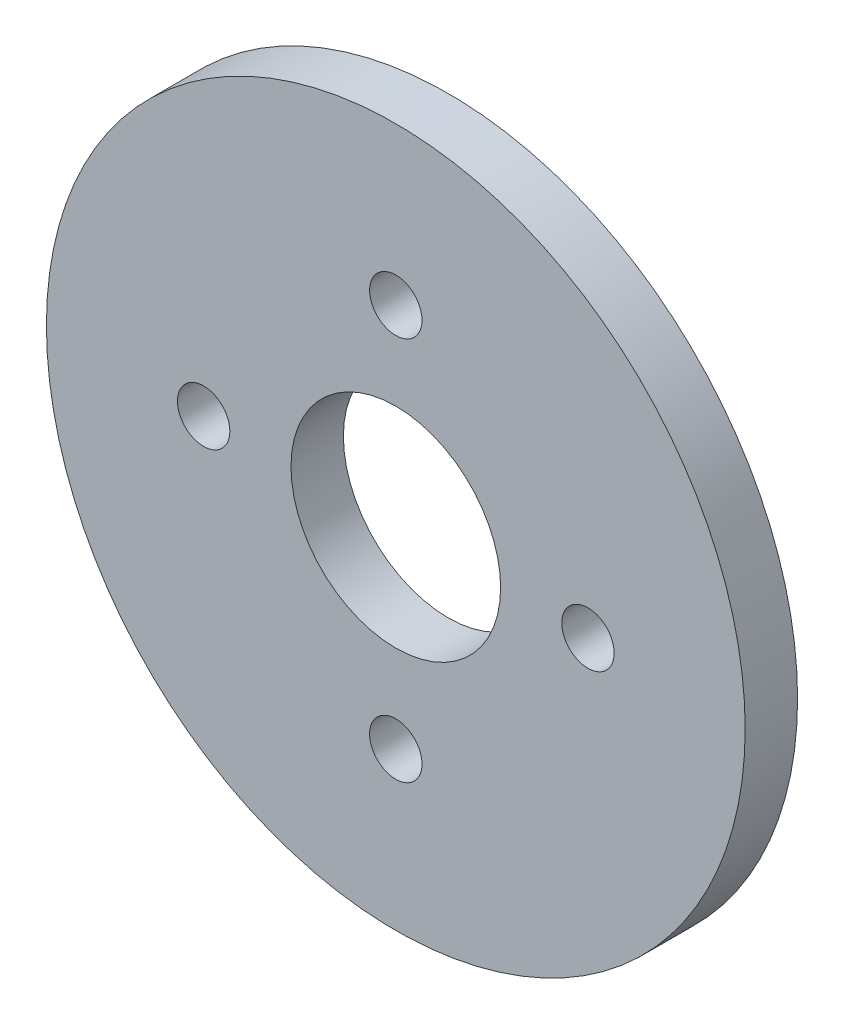
ISO-10303-21;
HEADER;
FILE_DESCRIPTION(('STEP AP214'),'2;1');
FILE_NAME('part.step','',(''),(''),'','','');
FILE_SCHEMA(('AUTOMOTIVE_DESIGN { 1 0 10303 214 1 1 1 1 }'));
ENDSEC;
DATA;
#1=APPLICATION_CONTEXT('core data for automotive mechanical design processes');
#2=APPLICATION_PROTOCOL_DEFINITION('international standard','automotive_design',2000,#1);
#3=PRODUCT_CONTEXT('',#1,'mechanical');
#4=PRODUCT('Part','Part','',(#3));
#5=PRODUCT_RELATED_PRODUCT_CATEGORY('part','',(#4));
#6=PRODUCT_DEFINITION_FORMATION('','',#4);
#7=PRODUCT_DEFINITION_CONTEXT('part definition',#1,'design');
#8=PRODUCT_DEFINITION('design','',#6,#7);
#9=PRODUCT_DEFINITION_SHAPE('','',#8);
#10=(LENGTH_UNIT() NAMED_UNIT(*) SI_UNIT(.MILLI.,.METRE.));
#11=(NAMED_UNIT(*) PLANE_ANGLE_UNIT() SI_UNIT($,.RADIAN.));
#12=(NAMED_UNIT(*) SI_UNIT($,.STERADIAN.) SOLID_ANGLE_UNIT());
#13=UNCERTAINTY_MEASURE_WITH_UNIT(LENGTH_MEASURE(1.E-05),#10,'distance_accuracy_value','');
#14=(GEOMETRIC_REPRESENTATION_CONTEXT(3) GLOBAL_UNCERTAINTY_ASSIGNED_CONTEXT((#13)) GLOBAL_UNIT_ASSIGNED_CONTEXT((#10,
#11,#12)) REPRESENTATION_CONTEXT('',''));
#15=CARTESIAN_POINT('',(0.,0.,0.));
#16=DIRECTION('',(0.,0.,1.));
#17=DIRECTION('',(1.,0.,0.));
#18=AXIS2_PLACEMENT_3D('',#15,#16,#17);
#19=CARTESIAN_POINT('',(0.,0.,3.));
#20=DIRECTION('',(0.,0.,1.));
#21=DIRECTION('',(1.,0.,0.));
#22=AXIS2_PLACEMENT_3D('',#19,#20,#21);
#23=PLANE('',#22);
#24=CARTESIAN_POINT('',(0.,0.,3.));
#25=DIRECTION('',(0.,0.,1.));
#26=DIRECTION('',(1.,0.,0.));
#27=AXIS2_PLACEMENT_3D('',#24,#25,#26);
#28=CIRCLE('',#27,6.);
#29=CARTESIAN_POINT('',(6.,0.,3.));
#30=VERTEX_POINT('',#29);
#31=EDGE_CURVE('E88',#30,#30,#28,.T.);
#32=ORIENTED_EDGE('',*,*,#31,.F.);
#33=EDGE_LOOP('',(#32));
#34=FACE_BOUND('',#33,.T.);
#35=CARTESIAN_POINT('',(6.22583384510764E-13,-11.,3.));
#36=DIRECTION('',(0.,0.,1.));
#37=DIRECTION('',(1.,0.,0.));
#38=AXIS2_PLACEMENT_3D('',#35,#36,#37);
#39=CIRCLE('',#38,1.50000000000067);
#40=CARTESIAN_POINT('',(1.50000000000129,-11.,3.));
#41=VERTEX_POINT('',#40);
#42=EDGE_CURVE('E68',#41,#41,#39,.T.);
#43=ORIENTED_EDGE('',*,*,#42,.F.);
#44=EDGE_LOOP('',(#43));
#45=FACE_BOUND('',#44,.T.);
#46=CARTESIAN_POINT('',(0.,11.,3.));
#47=DIRECTION('',(0.,0.,1.));
#48=DIRECTION('',(1.,0.,0.));
#49=AXIS2_PLACEMENT_3D('',#46,#47,#48);
#50=CIRCLE('',#49,1.5);
#51=CARTESIAN_POINT('',(1.5,11.,3.));
#52=VERTEX_POINT('',#51);
#53=EDGE_CURVE('E54',#52,#52,#50,.T.);
#54=ORIENTED_EDGE('',*,*,#53,.F.);
#55=EDGE_LOOP('',(#54));
#56=FACE_BOUND('',#55,.T.);
#57=CARTESIAN_POINT('',(0.,0.,3.));
#58=DIRECTION('',(0.,0.,1.));
#59=DIRECTION('',(1.,0.,0.));
#60=AXIS2_PLACEMENT_3D('',#57,#58,#59);
#61=CIRCLE('',#60,20.);
#62=CARTESIAN_POINT('',(20.,0.,3.));
#63=VERTEX_POINT('',#62);
#64=EDGE_CURVE('E10',#63,#63,#61,.T.);
#65=ORIENTED_EDGE('',*,*,#64,.T.);
#66=EDGE_LOOP('',(#65));
#67=FACE_BOUND('',#66,.T.);
#68=CARTESIAN_POINT('',(11.0000000000003,3.11291692255382E-13,3.));
#69=DIRECTION('',(0.,0.,1.));
#70=DIRECTION('',(1.,0.,0.));
#71=AXIS2_PLACEMENT_3D('',#68,#69,#70);
#72=CIRCLE('',#71,1.50000000000024);
#73=CARTESIAN_POINT('',(12.5000000000006,3.11291692255382E-13,3.));
#74=VERTEX_POINT('',#73);
#75=EDGE_CURVE('E60',#74,#74,#72,.T.);
#76=ORIENTED_EDGE('',*,*,#75,.F.);
#77=EDGE_LOOP('',(#76));
#78=FACE_BOUND('',#77,.T.);
#79=CARTESIAN_POINT('',(-10.9999999999997,-3.12638803734444E-13,3.));
#80=DIRECTION('',(0.,0.,1.));
#81=DIRECTION('',(1.,0.,0.));
#82=AXIS2_PLACEMENT_3D('',#79,#80,#81);
#83=CIRCLE('',#82,1.5000000000005);
#84=CARTESIAN_POINT('',(-9.49999999999919,-3.12638803734444E-13,3.));
#85=VERTEX_POINT('',#84);
#86=EDGE_CURVE('E76',#85,#85,#83,.T.);
#87=ORIENTED_EDGE('',*,*,#86,.F.);
#88=EDGE_LOOP('',(#87));
#89=FACE_BOUND('',#88,.T.);
#90=ADVANCED_FACE('F41',(#34,#45,#56,#67,#78,#89),#23,.T.);
#91=CARTESIAN_POINT('',(0.,0.,0.));
#92=DIRECTION('',(0.,0.,1.));
#93=DIRECTION('',(1.,0.,0.));
#94=AXIS2_PLACEMENT_3D('',#91,#92,#93);
#95=PLANE('',#94);
#96=CARTESIAN_POINT('',(0.,0.,0.));
#97=DIRECTION('',(0.,0.,1.));
#98=DIRECTION('',(1.,0.,0.));
#99=AXIS2_PLACEMENT_3D('',#96,#97,#98);
#100=CIRCLE('',#99,6.);
#101=CARTESIAN_POINT('',(6.,0.,0.));
#102=VERTEX_POINT('',#101);
#103=EDGE_CURVE('E84',#102,#102,#100,.T.);
#104=ORIENTED_EDGE('',*,*,#103,.T.);
#105=EDGE_LOOP('',(#104));
#106=FACE_BOUND('',#105,.T.);
#107=CARTESIAN_POINT('',(0.,0.,0.));
#108=DIRECTION('',(0.,0.,1.));
#109=DIRECTION('',(1.,0.,0.));
#110=AXIS2_PLACEMENT_3D('',#107,#108,#109);
#111=CIRCLE('',#110,20.);
#112=CARTESIAN_POINT('',(20.,0.,0.));
#113=VERTEX_POINT('',#112);
#114=EDGE_CURVE('E45',#113,#113,#111,.T.);
#115=ORIENTED_EDGE('',*,*,#114,.F.);
#116=EDGE_LOOP('',(#115));
#117=FACE_BOUND('',#116,.T.);
#118=CARTESIAN_POINT('',(0.,11.,0.));
#119=DIRECTION('',(0.,0.,1.));
#120=DIRECTION('',(1.,0.,0.));
#121=AXIS2_PLACEMENT_3D('',#118,#119,#120);
#122=CIRCLE('',#121,1.5);
#123=CARTESIAN_POINT('',(1.5,11.,0.));
#124=VERTEX_POINT('',#123);
#125=EDGE_CURVE('E56',#124,#124,#122,.T.);
#126=ORIENTED_EDGE('',*,*,#125,.T.);
#127=EDGE_LOOP('',(#126));
#128=FACE_BOUND('',#127,.T.);
#129=CARTESIAN_POINT('',(11.0000000000003,3.11291692255382E-13,0.));
#130=DIRECTION('',(0.,0.,1.));
#131=DIRECTION('',(1.,0.,0.));
#132=AXIS2_PLACEMENT_3D('',#129,#130,#131);
#133=CIRCLE('',#132,1.50000000000024);
#134=CARTESIAN_POINT('',(12.5000000000006,3.11291692255382E-13,0.));
#135=VERTEX_POINT('',#134);
#136=EDGE_CURVE('E64',#135,#135,#133,.T.);
#137=ORIENTED_EDGE('',*,*,#136,.T.);
#138=EDGE_LOOP('',(#137));
#139=FACE_BOUND('',#138,.T.);
#140=CARTESIAN_POINT('',(6.22583384510764E-13,-11.,0.));
#141=DIRECTION('',(0.,0.,1.));
#142=DIRECTION('',(1.,0.,0.));
#143=AXIS2_PLACEMENT_3D('',#140,#141,#142);
#144=CIRCLE('',#143,1.50000000000067);
#145=CARTESIAN_POINT('',(1.50000000000129,-11.,0.));
#146=VERTEX_POINT('',#145);
#147=EDGE_CURVE('E72',#146,#146,#144,.T.);
#148=ORIENTED_EDGE('',*,*,#147,.T.);
#149=EDGE_LOOP('',(#148));
#150=FACE_BOUND('',#149,.T.);
#151=CARTESIAN_POINT('',(-10.9999999999997,-3.12638803734444E-13,0.));
#152=DIRECTION('',(0.,0.,1.));
#153=DIRECTION('',(1.,0.,0.));
#154=AXIS2_PLACEMENT_3D('',#151,#152,#153);
#155=CIRCLE('',#154,1.5000000000005);
#156=CARTESIAN_POINT('',(-9.49999999999919,-3.12638803734444E-13,0.));
#157=VERTEX_POINT('',#156);
#158=EDGE_CURVE('E80',#157,#157,#155,.T.);
#159=ORIENTED_EDGE('',*,*,#158,.T.);
#160=EDGE_LOOP('',(#159));
#161=FACE_BOUND('',#160,.T.);
#162=ADVANCED_FACE('F96',(#106,#117,#128,#139,#150,#161),#95,.F.);
#163=CARTESIAN_POINT('',(0.,0.,3.));
#164=DIRECTION('',(0.,0.,-1.));
#165=DIRECTION('',(-1.,0.,0.));
#166=AXIS2_PLACEMENT_3D('',#163,#164,#165);
#167=CYLINDRICAL_SURFACE('',#166,20.);
#168=ORIENTED_EDGE('',*,*,#64,.F.);
#169=EDGE_LOOP('',(#168));
#170=FACE_BOUND('',#169,.T.);
#171=ORIENTED_EDGE('',*,*,#114,.T.);
#172=EDGE_LOOP('',(#171));
#173=FACE_BOUND('',#172,.T.);
#174=ADVANCED_FACE('F43',(#170,#173),#167,.T.);
#175=CARTESIAN_POINT('',(0.,11.,3.));
#176=DIRECTION('',(0.,0.,-1.));
#177=DIRECTION('',(-1.,0.,0.));
#178=AXIS2_PLACEMENT_3D('',#175,#176,#177);
#179=CYLINDRICAL_SURFACE('',#178,1.5);
#180=ORIENTED_EDGE('',*,*,#53,.T.);
#181=EDGE_LOOP('',(#180));
#182=FACE_BOUND('',#181,.T.);
#183=ORIENTED_EDGE('',*,*,#125,.F.);
#184=EDGE_LOOP('',(#183));
#185=FACE_BOUND('',#184,.T.);
#186=ADVANCED_FACE('F127',(#182,#185),#179,.F.);
#187=CARTESIAN_POINT('',(11.0000000000003,3.11291692255382E-13,3.));
#188=DIRECTION('',(0.,0.,-1.));
#189=DIRECTION('',(-1.,0.,0.));
#190=AXIS2_PLACEMENT_3D('',#187,#188,#189);
#191=CYLINDRICAL_SURFACE('',#190,1.50000000000024);
#192=ORIENTED_EDGE('',*,*,#75,.T.);
#193=EDGE_LOOP('',(#192));
#194=FACE_BOUND('',#193,.T.);
#195=ORIENTED_EDGE('',*,*,#136,.F.);
#196=EDGE_LOOP('',(#195));
#197=FACE_BOUND('',#196,.T.);
#198=ADVANCED_FACE('F132',(#194,#197),#191,.F.);
#199=CARTESIAN_POINT('',(6.22583384510764E-13,-11.,3.));
#200=DIRECTION('',(0.,0.,-1.));
#201=DIRECTION('',(-1.,0.,0.));
#202=AXIS2_PLACEMENT_3D('',#199,#200,#201);
#203=CYLINDRICAL_SURFACE('',#202,1.50000000000067);
#204=ORIENTED_EDGE('',*,*,#42,.T.);
#205=EDGE_LOOP('',(#204));
#206=FACE_BOUND('',#205,.T.);
#207=ORIENTED_EDGE('',*,*,#147,.F.);
#208=EDGE_LOOP('',(#207));
#209=FACE_BOUND('',#208,.T.);
#210=ADVANCED_FACE('F119',(#206,#209),#203,.F.);
#211=CARTESIAN_POINT('',(-10.9999999999997,-3.12638803734444E-13,3.));
#212=DIRECTION('',(0.,0.,-1.));
#213=DIRECTION('',(-1.,0.,0.));
#214=AXIS2_PLACEMENT_3D('',#211,#212,#213);
#215=CYLINDRICAL_SURFACE('',#214,1.5000000000005);
#216=ORIENTED_EDGE('',*,*,#86,.T.);
#217=EDGE_LOOP('',(#216));
#218=FACE_BOUND('',#217,.T.);
#219=ORIENTED_EDGE('',*,*,#158,.F.);
#220=EDGE_LOOP('',(#219));
#221=FACE_BOUND('',#220,.T.);
#222=ADVANCED_FACE('F102',(#218,#221),#215,.F.);
#223=CARTESIAN_POINT('',(0.,0.,0.));
#224=DIRECTION('',(0.,0.,1.));
#225=DIRECTION('',(1.,0.,0.));
#226=AXIS2_PLACEMENT_3D('',#223,#224,#225);
#227=CYLINDRICAL_SURFACE('',#226,6.);
#228=ORIENTED_EDGE('',*,*,#103,.F.);
#229=EDGE_LOOP('',(#228));
#230=FACE_BOUND('',#229,.T.);
#231=ORIENTED_EDGE('',*,*,#31,.T.);
#232=EDGE_LOOP('',(#231));
#233=FACE_BOUND('',#232,.T.);
#234=ADVANCED_FACE('F99',(#230,#233),#227,.F.);
#235=CLOSED_SHELL('',(#90,#162,#174,#186,#198,#210,#222,#234));
#236=MANIFOLD_SOLID_BREP('B2',#235);
#237=ADVANCED_BREP_SHAPE_REPRESENTATION('',(#18,#236),#14);
#238=SHAPE_DEFINITION_REPRESENTATION(#9,#237);
ENDSEC;
END-ISO-10303-21;
